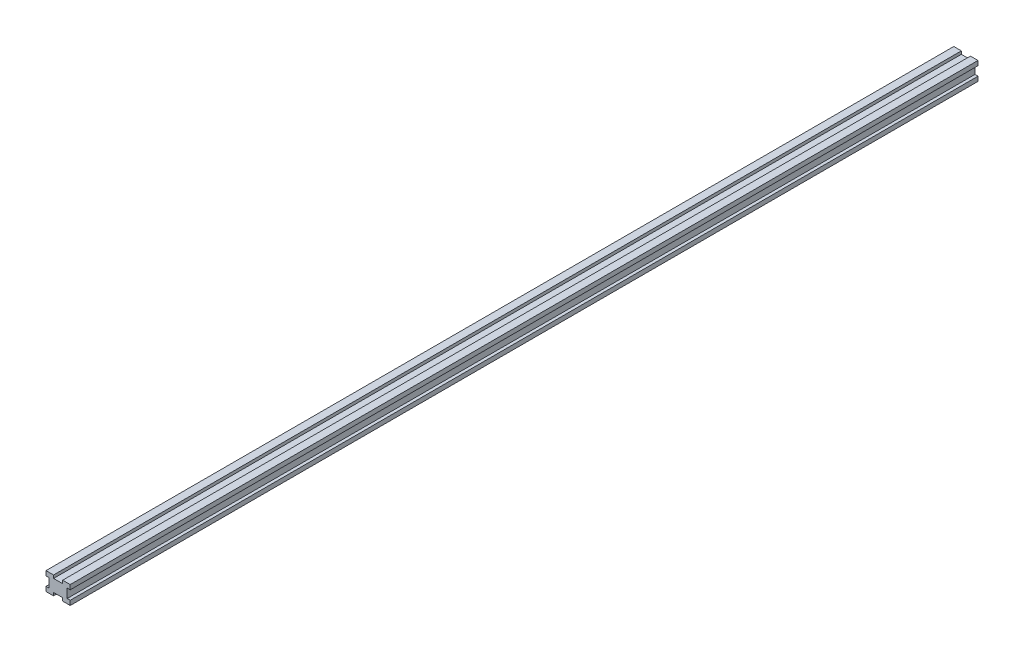
ISO-10303-21;
HEADER;
FILE_DESCRIPTION(('STEP AP214'),'2;1');
FILE_NAME('part.step','',(''),(''),'','','');
FILE_SCHEMA(('AUTOMOTIVE_DESIGN { 1 0 10303 214 1 1 1 1 }'));
ENDSEC;
DATA;
#1=APPLICATION_CONTEXT('core data for automotive mechanical design processes');
#2=APPLICATION_PROTOCOL_DEFINITION('international standard','automotive_design',2000,#1);
#3=PRODUCT_CONTEXT('',#1,'mechanical');
#4=PRODUCT('Part','Part','',(#3));
#5=PRODUCT_RELATED_PRODUCT_CATEGORY('part','',(#4));
#6=PRODUCT_DEFINITION_FORMATION('','',#4);
#7=PRODUCT_DEFINITION_CONTEXT('part definition',#1,'design');
#8=PRODUCT_DEFINITION('design','',#6,#7);
#9=PRODUCT_DEFINITION_SHAPE('','',#8);
#10=(LENGTH_UNIT() NAMED_UNIT(*) SI_UNIT(.MILLI.,.METRE.));
#11=(NAMED_UNIT(*) PLANE_ANGLE_UNIT() SI_UNIT($,.RADIAN.));
#12=(NAMED_UNIT(*) SI_UNIT($,.STERADIAN.) SOLID_ANGLE_UNIT());
#13=UNCERTAINTY_MEASURE_WITH_UNIT(LENGTH_MEASURE(1.E-05),#10,'distance_accuracy_value','');
#14=(GEOMETRIC_REPRESENTATION_CONTEXT(3) GLOBAL_UNCERTAINTY_ASSIGNED_CONTEXT((#13)) GLOBAL_UNIT_ASSIGNED_CONTEXT((#10,
#11,#12)) REPRESENTATION_CONTEXT('',''));
#15=CARTESIAN_POINT('',(0.,0.,0.));
#16=DIRECTION('',(0.,0.,1.));
#17=DIRECTION('',(1.,0.,0.));
#18=AXIS2_PLACEMENT_3D('',#15,#16,#17);
#19=CARTESIAN_POINT('',(20.,-15.,1500.));
#20=DIRECTION('',(-1.,0.,0.));
#21=DIRECTION('',(0.,0.,1.));
#22=AXIS2_PLACEMENT_3D('',#19,#20,#21);
#23=PLANE('',#22);
#24=DIRECTION('',(0.,1.,0.));
#25=VECTOR('',#24,1.);
#26=CARTESIAN_POINT('',(20.,-15.,0.));
#27=LINE('',#26,#25);
#28=CARTESIAN_POINT('',(20.,-15.,0.));
#29=VERTEX_POINT('',#28);
#30=CARTESIAN_POINT('',(20.,-7.5,0.));
#31=VERTEX_POINT('',#30);
#32=EDGE_CURVE('E193',#29,#31,#27,.T.);
#33=ORIENTED_EDGE('',*,*,#32,.T.);
#34=DIRECTION('',(0.,0.,1.));
#35=VECTOR('',#34,1.);
#36=CARTESIAN_POINT('',(20.,-7.5,0.));
#37=LINE('',#36,#35);
#38=CARTESIAN_POINT('',(20.,-7.5,1500.));
#39=VERTEX_POINT('',#38);
#40=EDGE_CURVE('E274',#31,#39,#37,.T.);
#41=ORIENTED_EDGE('',*,*,#40,.T.);
#42=DIRECTION('',(0.,1.,0.));
#43=VECTOR('',#42,1.);
#44=CARTESIAN_POINT('',(20.,-15.,1500.));
#45=LINE('',#44,#43);
#46=CARTESIAN_POINT('',(20.,-15.,1500.));
#47=VERTEX_POINT('',#46);
#48=EDGE_CURVE('E282',#47,#39,#45,.T.);
#49=ORIENTED_EDGE('',*,*,#48,.F.);
#50=DIRECTION('',(0.,0.,-1.));
#51=VECTOR('',#50,1.);
#52=CARTESIAN_POINT('',(20.,-15.,1500.));
#53=LINE('',#52,#51);
#54=EDGE_CURVE('E214',#47,#29,#53,.T.);
#55=ORIENTED_EDGE('',*,*,#54,.T.);
#56=EDGE_LOOP('',(#33,#41,#49,#55));
#57=FACE_BOUND('',#56,.T.);
#58=ADVANCED_FACE('F33',(#57),#23,.F.);
#59=CARTESIAN_POINT('',(-20.,-15.,1500.));
#60=DIRECTION('',(1.,0.,0.));
#61=DIRECTION('',(0.,0.,-1.));
#62=AXIS2_PLACEMENT_3D('',#59,#60,#61);
#63=PLANE('',#62);
#64=DIRECTION('',(0.,-1.,0.));
#65=VECTOR('',#64,1.);
#66=CARTESIAN_POINT('',(-20.,-15.,0.));
#67=LINE('',#66,#65);
#68=CARTESIAN_POINT('',(-20.,15.,0.));
#69=VERTEX_POINT('',#68);
#70=CARTESIAN_POINT('',(-20.,7.5,0.));
#71=VERTEX_POINT('',#70);
#72=EDGE_CURVE('E207',#69,#71,#67,.T.);
#73=ORIENTED_EDGE('',*,*,#72,.T.);
#74=DIRECTION('',(0.,0.,1.));
#75=VECTOR('',#74,1.);
#76=CARTESIAN_POINT('',(-20.,7.5,0.));
#77=LINE('',#76,#75);
#78=CARTESIAN_POINT('',(-20.,7.5,1500.));
#79=VERTEX_POINT('',#78);
#80=EDGE_CURVE('E255',#71,#79,#77,.T.);
#81=ORIENTED_EDGE('',*,*,#80,.T.);
#82=DIRECTION('',(0.,-1.,0.));
#83=VECTOR('',#82,1.);
#84=CARTESIAN_POINT('',(-20.,-15.,1500.));
#85=LINE('',#84,#83);
#86=CARTESIAN_POINT('',(-20.,15.,1500.));
#87=VERTEX_POINT('',#86);
#88=EDGE_CURVE('E227',#87,#79,#85,.T.);
#89=ORIENTED_EDGE('',*,*,#88,.F.);
#90=DIRECTION('',(0.,0.,-1.));
#91=VECTOR('',#90,1.);
#92=CARTESIAN_POINT('',(-20.,15.,1500.));
#93=LINE('',#92,#91);
#94=EDGE_CURVE('E41',#87,#69,#93,.T.);
#95=ORIENTED_EDGE('',*,*,#94,.T.);
#96=EDGE_LOOP('',(#73,#81,#89,#95));
#97=FACE_BOUND('',#96,.T.);
#98=ADVANCED_FACE('F224',(#97),#63,.F.);
#99=CARTESIAN_POINT('',(-20.,-15.,1500.));
#100=DIRECTION('',(0.,1.,0.));
#101=DIRECTION('',(0.,0.,1.));
#102=AXIS2_PLACEMENT_3D('',#99,#100,#101);
#103=PLANE('',#102);
#104=DIRECTION('',(1.,0.,0.));
#105=VECTOR('',#104,1.);
#106=CARTESIAN_POINT('',(-20.,-15.,0.));
#107=LINE('',#106,#105);
#108=CARTESIAN_POINT('',(-20.,-15.,0.));
#109=VERTEX_POINT('',#108);
#110=CARTESIAN_POINT('',(-7.5,-15.,0.));
#111=VERTEX_POINT('',#110);
#112=EDGE_CURVE('E211',#109,#111,#107,.T.);
#113=ORIENTED_EDGE('',*,*,#112,.T.);
#114=DIRECTION('',(0.,0.,1.));
#115=VECTOR('',#114,1.);
#116=CARTESIAN_POINT('',(-7.5,-15.,0.));
#117=LINE('',#116,#115);
#118=CARTESIAN_POINT('',(-7.5,-15.,1500.));
#119=VERTEX_POINT('',#118);
#120=EDGE_CURVE('E308',#111,#119,#117,.T.);
#121=ORIENTED_EDGE('',*,*,#120,.T.);
#122=DIRECTION('',(1.,0.,0.));
#123=VECTOR('',#122,1.);
#124=CARTESIAN_POINT('',(-20.,-15.,1500.));
#125=LINE('',#124,#123);
#126=CARTESIAN_POINT('',(-20.,-15.,1500.));
#127=VERTEX_POINT('',#126);
#128=EDGE_CURVE('E203',#127,#119,#125,.T.);
#129=ORIENTED_EDGE('',*,*,#128,.F.);
#130=DIRECTION('',(0.,0.,-1.));
#131=VECTOR('',#130,1.);
#132=CARTESIAN_POINT('',(-20.,-15.,1500.));
#133=LINE('',#132,#131);
#134=EDGE_CURVE('E217',#127,#109,#133,.T.);
#135=ORIENTED_EDGE('',*,*,#134,.T.);
#136=EDGE_LOOP('',(#113,#121,#129,#135));
#137=FACE_BOUND('',#136,.T.);
#138=ADVANCED_FACE('F307',(#137),#103,.F.);
#139=CARTESIAN_POINT('',(-20.,15.,1500.));
#140=DIRECTION('',(0.,-1.,0.));
#141=DIRECTION('',(0.,0.,-1.));
#142=AXIS2_PLACEMENT_3D('',#139,#140,#141);
#143=PLANE('',#142);
#144=DIRECTION('',(-1.,0.,0.));
#145=VECTOR('',#144,1.);
#146=CARTESIAN_POINT('',(-20.,15.,0.));
#147=LINE('',#146,#145);
#148=CARTESIAN_POINT('',(20.,15.,0.));
#149=VERTEX_POINT('',#148);
#150=CARTESIAN_POINT('',(7.5,15.,0.));
#151=VERTEX_POINT('',#150);
#152=EDGE_CURVE('E192',#149,#151,#147,.T.);
#153=ORIENTED_EDGE('',*,*,#152,.T.);
#154=DIRECTION('',(0.,0.,1.));
#155=VECTOR('',#154,1.);
#156=CARTESIAN_POINT('',(7.5,15.,0.));
#157=LINE('',#156,#155);
#158=CARTESIAN_POINT('',(7.5,15.,1500.));
#159=VERTEX_POINT('',#158);
#160=EDGE_CURVE('E194',#151,#159,#157,.T.);
#161=ORIENTED_EDGE('',*,*,#160,.T.);
#162=DIRECTION('',(-1.,0.,0.));
#163=VECTOR('',#162,1.);
#164=CARTESIAN_POINT('',(-20.,15.,1500.));
#165=LINE('',#164,#163);
#166=CARTESIAN_POINT('',(20.,15.,1500.));
#167=VERTEX_POINT('',#166);
#168=EDGE_CURVE('E286',#167,#159,#165,.T.);
#169=ORIENTED_EDGE('',*,*,#168,.F.);
#170=DIRECTION('',(0.,0.,-1.));
#171=VECTOR('',#170,1.);
#172=CARTESIAN_POINT('',(20.,15.,1500.));
#173=LINE('',#172,#171);
#174=EDGE_CURVE('E11',#167,#149,#173,.T.);
#175=ORIENTED_EDGE('',*,*,#174,.T.);
#176=EDGE_LOOP('',(#153,#161,#169,#175));
#177=FACE_BOUND('',#176,.T.);
#178=ADVANCED_FACE('F352',(#177),#143,.F.);
#179=CARTESIAN_POINT('',(20.,7.5,1500.));
#180=VERTEX_POINT('',#179);
#181=EDGE_CURVE('E185',#180,#167,#45,.T.);
#182=ORIENTED_EDGE('',*,*,#181,.F.);
#183=DIRECTION('',(0.,0.,1.));
#184=VECTOR('',#183,1.);
#185=CARTESIAN_POINT('',(20.,7.5,0.));
#186=LINE('',#185,#184);
#187=CARTESIAN_POINT('',(20.,7.5,0.));
#188=VERTEX_POINT('',#187);
#189=EDGE_CURVE('E173',#188,#180,#186,.T.);
#190=ORIENTED_EDGE('',*,*,#189,.F.);
#191=EDGE_CURVE('E183',#188,#149,#27,.T.);
#192=ORIENTED_EDGE('',*,*,#191,.T.);
#193=ORIENTED_EDGE('',*,*,#174,.F.);
#194=EDGE_LOOP('',(#182,#190,#192,#193));
#195=FACE_BOUND('',#194,.T.);
#196=ADVANCED_FACE('F35',(#195),#23,.F.);
#197=CARTESIAN_POINT('',(-7.5,15.,1500.));
#198=VERTEX_POINT('',#197);
#199=EDGE_CURVE('E285',#198,#87,#165,.T.);
#200=ORIENTED_EDGE('',*,*,#199,.F.);
#201=DIRECTION('',(0.,0.,1.));
#202=VECTOR('',#201,1.);
#203=CARTESIAN_POINT('',(-7.5,15.,0.));
#204=LINE('',#203,#202);
#205=CARTESIAN_POINT('',(-7.5,15.,0.));
#206=VERTEX_POINT('',#205);
#207=EDGE_CURVE('E269',#206,#198,#204,.T.);
#208=ORIENTED_EDGE('',*,*,#207,.F.);
#209=EDGE_CURVE('E197',#206,#69,#147,.T.);
#210=ORIENTED_EDGE('',*,*,#209,.T.);
#211=ORIENTED_EDGE('',*,*,#94,.F.);
#212=EDGE_LOOP('',(#200,#208,#210,#211));
#213=FACE_BOUND('',#212,.T.);
#214=ADVANCED_FACE('F351',(#213),#143,.F.);
#215=CARTESIAN_POINT('',(-20.,-7.5,1500.));
#216=VERTEX_POINT('',#215);
#217=EDGE_CURVE('E288',#216,#127,#85,.T.);
#218=ORIENTED_EDGE('',*,*,#217,.F.);
#219=DIRECTION('',(0.,0.,1.));
#220=VECTOR('',#219,1.);
#221=CARTESIAN_POINT('',(-20.,-7.5,0.));
#222=LINE('',#221,#220);
#223=CARTESIAN_POINT('',(-20.,-7.5,0.));
#224=VERTEX_POINT('',#223);
#225=EDGE_CURVE('E239',#224,#216,#222,.T.);
#226=ORIENTED_EDGE('',*,*,#225,.F.);
#227=EDGE_CURVE('E206',#224,#109,#67,.T.);
#228=ORIENTED_EDGE('',*,*,#227,.T.);
#229=ORIENTED_EDGE('',*,*,#134,.F.);
#230=EDGE_LOOP('',(#218,#226,#228,#229));
#231=FACE_BOUND('',#230,.T.);
#232=ADVANCED_FACE('F302',(#231),#63,.F.);
#233=CARTESIAN_POINT('',(7.5,-15.,1500.));
#234=VERTEX_POINT('',#233);
#235=EDGE_CURVE('E289',#234,#47,#125,.T.);
#236=ORIENTED_EDGE('',*,*,#235,.F.);
#237=DIRECTION('',(0.,0.,1.));
#238=VECTOR('',#237,1.);
#239=CARTESIAN_POINT('',(7.5,-15.,0.));
#240=LINE('',#239,#238);
#241=CARTESIAN_POINT('',(7.5,-15.,0.));
#242=VERTEX_POINT('',#241);
#243=EDGE_CURVE('E324',#242,#234,#240,.T.);
#244=ORIENTED_EDGE('',*,*,#243,.F.);
#245=EDGE_CURVE('E210',#242,#29,#107,.T.);
#246=ORIENTED_EDGE('',*,*,#245,.T.);
#247=ORIENTED_EDGE('',*,*,#54,.F.);
#248=EDGE_LOOP('',(#236,#244,#246,#247));
#249=FACE_BOUND('',#248,.T.);
#250=ADVANCED_FACE('F362',(#249),#103,.F.);
#251=CARTESIAN_POINT('',(0.,0.,1500.));
#252=DIRECTION('',(0.,0.,-1.));
#253=DIRECTION('',(-1.,0.,0.));
#254=AXIS2_PLACEMENT_3D('',#251,#252,#253);
#255=PLANE('',#254);
#256=ORIENTED_EDGE('',*,*,#48,.T.);
#257=DIRECTION('',(1.,0.,0.));
#258=VECTOR('',#257,1.);
#259=CARTESIAN_POINT('',(15.,-7.5,1500.));
#260=LINE('',#259,#258);
#261=CARTESIAN_POINT('',(15.,-7.5,1500.));
#262=VERTEX_POINT('',#261);
#263=EDGE_CURVE('E178',#262,#39,#260,.T.);
#264=ORIENTED_EDGE('',*,*,#263,.F.);
#265=DIRECTION('',(0.,-1.,0.));
#266=VECTOR('',#265,1.);
#267=CARTESIAN_POINT('',(15.,7.5,1500.));
#268=LINE('',#267,#266);
#269=CARTESIAN_POINT('',(15.,7.5,1500.));
#270=VERTEX_POINT('',#269);
#271=EDGE_CURVE('E315',#270,#262,#268,.T.);
#272=ORIENTED_EDGE('',*,*,#271,.F.);
#273=DIRECTION('',(-1.,0.,0.));
#274=VECTOR('',#273,1.);
#275=CARTESIAN_POINT('',(20.,7.5,1500.));
#276=LINE('',#275,#274);
#277=EDGE_CURVE('E312',#180,#270,#276,.T.);
#278=ORIENTED_EDGE('',*,*,#277,.F.);
#279=ORIENTED_EDGE('',*,*,#181,.T.);
#280=ORIENTED_EDGE('',*,*,#168,.T.);
#281=DIRECTION('',(0.,1.,0.));
#282=VECTOR('',#281,1.);
#283=CARTESIAN_POINT('',(7.5,10.,1500.));
#284=LINE('',#283,#282);
#285=CARTESIAN_POINT('',(7.5,10.,1500.));
#286=VERTEX_POINT('',#285);
#287=EDGE_CURVE('E264',#286,#159,#284,.T.);
#288=ORIENTED_EDGE('',*,*,#287,.F.);
#289=DIRECTION('',(1.,0.,0.));
#290=VECTOR('',#289,1.);
#291=CARTESIAN_POINT('',(-7.5,10.,1500.));
#292=LINE('',#291,#290);
#293=CARTESIAN_POINT('',(-7.5,10.,1500.));
#294=VERTEX_POINT('',#293);
#295=EDGE_CURVE('E273',#294,#286,#292,.T.);
#296=ORIENTED_EDGE('',*,*,#295,.F.);
#297=DIRECTION('',(0.,-1.,0.));
#298=VECTOR('',#297,1.);
#299=CARTESIAN_POINT('',(-7.5,15.,1500.));
#300=LINE('',#299,#298);
#301=EDGE_CURVE('E270',#198,#294,#300,.T.);
#302=ORIENTED_EDGE('',*,*,#301,.F.);
#303=ORIENTED_EDGE('',*,*,#199,.T.);
#304=ORIENTED_EDGE('',*,*,#88,.T.);
#305=DIRECTION('',(-1.,0.,0.));
#306=VECTOR('',#305,1.);
#307=CARTESIAN_POINT('',(-20.,7.5,1500.));
#308=LINE('',#307,#306);
#309=CARTESIAN_POINT('',(-15.,7.5,1500.));
#310=VERTEX_POINT('',#309);
#311=EDGE_CURVE('E253',#310,#79,#308,.T.);
#312=ORIENTED_EDGE('',*,*,#311,.F.);
#313=DIRECTION('',(0.,1.,0.));
#314=VECTOR('',#313,1.);
#315=CARTESIAN_POINT('',(-15.,7.5,1500.));
#316=LINE('',#315,#314);
#317=CARTESIAN_POINT('',(-15.,-7.5,1500.));
#318=VERTEX_POINT('',#317);
#319=EDGE_CURVE('E250',#318,#310,#316,.T.);
#320=ORIENTED_EDGE('',*,*,#319,.F.);
#321=DIRECTION('',(1.,0.,0.));
#322=VECTOR('',#321,1.);
#323=CARTESIAN_POINT('',(-15.,-7.5,1500.));
#324=LINE('',#323,#322);
#325=EDGE_CURVE('E247',#216,#318,#324,.T.);
#326=ORIENTED_EDGE('',*,*,#325,.F.);
#327=ORIENTED_EDGE('',*,*,#217,.T.);
#328=ORIENTED_EDGE('',*,*,#128,.T.);
#329=DIRECTION('',(0.,-1.,0.));
#330=VECTOR('',#329,1.);
#331=CARTESIAN_POINT('',(-7.5,-15.,1500.));
#332=LINE('',#331,#330);
#333=CARTESIAN_POINT('',(-7.5,-10.,1500.));
#334=VERTEX_POINT('',#333);
#335=EDGE_CURVE('E320',#334,#119,#332,.T.);
#336=ORIENTED_EDGE('',*,*,#335,.F.);
#337=DIRECTION('',(-1.,0.,0.));
#338=VECTOR('',#337,1.);
#339=CARTESIAN_POINT('',(-7.5,-10.,1500.));
#340=LINE('',#339,#338);
#341=CARTESIAN_POINT('',(7.5,-10.,1500.));
#342=VERTEX_POINT('',#341);
#343=EDGE_CURVE('E407',#342,#334,#340,.T.);
#344=ORIENTED_EDGE('',*,*,#343,.F.);
#345=DIRECTION('',(0.,1.,0.));
#346=VECTOR('',#345,1.);
#347=CARTESIAN_POINT('',(7.5,-10.,1500.));
#348=LINE('',#347,#346);
#349=EDGE_CURVE('E257',#234,#342,#348,.T.);
#350=ORIENTED_EDGE('',*,*,#349,.F.);
#351=ORIENTED_EDGE('',*,*,#235,.T.);
#352=EDGE_LOOP('',(#256,#264,#272,#278,#279,#280,#288,#296,#302,#303,#304,#312,#320,#326,#327,
#328,#336,#344,#350,#351));
#353=FACE_BOUND('',#352,.T.);
#354=ADVANCED_FACE('F296',(#353),#255,.F.);
#355=CARTESIAN_POINT('',(0.,0.,0.));
#356=DIRECTION('',(0.,0.,-1.));
#357=DIRECTION('',(-1.,0.,0.));
#358=AXIS2_PLACEMENT_3D('',#355,#356,#357);
#359=PLANE('',#358);
#360=DIRECTION('',(1.,0.,0.));
#361=VECTOR('',#360,1.);
#362=CARTESIAN_POINT('',(15.,-7.5,0.));
#363=LINE('',#362,#361);
#364=CARTESIAN_POINT('',(15.,-7.5,0.));
#365=VERTEX_POINT('',#364);
#366=EDGE_CURVE('E186',#365,#31,#363,.T.);
#367=ORIENTED_EDGE('',*,*,#366,.T.);
#368=ORIENTED_EDGE('',*,*,#32,.F.);
#369=ORIENTED_EDGE('',*,*,#245,.F.);
#370=DIRECTION('',(0.,1.,0.));
#371=VECTOR('',#370,1.);
#372=CARTESIAN_POINT('',(7.5,-10.,0.));
#373=LINE('',#372,#371);
#374=CARTESIAN_POINT('',(7.5,-10.,0.));
#375=VERTEX_POINT('',#374);
#376=EDGE_CURVE('E410',#242,#375,#373,.T.);
#377=ORIENTED_EDGE('',*,*,#376,.T.);
#378=DIRECTION('',(-1.,0.,0.));
#379=VECTOR('',#378,1.);
#380=CARTESIAN_POINT('',(-7.5,-10.,0.));
#381=LINE('',#380,#379);
#382=CARTESIAN_POINT('',(-7.5,-10.,0.));
#383=VERTEX_POINT('',#382);
#384=EDGE_CURVE('E56',#375,#383,#381,.T.);
#385=ORIENTED_EDGE('',*,*,#384,.T.);
#386=DIRECTION('',(0.,-1.,0.));
#387=VECTOR('',#386,1.);
#388=CARTESIAN_POINT('',(-7.5,-15.,0.));
#389=LINE('',#388,#387);
#390=EDGE_CURVE('E325',#383,#111,#389,.T.);
#391=ORIENTED_EDGE('',*,*,#390,.T.);
#392=ORIENTED_EDGE('',*,*,#112,.F.);
#393=ORIENTED_EDGE('',*,*,#227,.F.);
#394=DIRECTION('',(1.,0.,0.));
#395=VECTOR('',#394,1.);
#396=CARTESIAN_POINT('',(-15.,-7.5,0.));
#397=LINE('',#396,#395);
#398=CARTESIAN_POINT('',(-15.,-7.5,0.));
#399=VERTEX_POINT('',#398);
#400=EDGE_CURVE('E243',#224,#399,#397,.T.);
#401=ORIENTED_EDGE('',*,*,#400,.T.);
#402=DIRECTION('',(0.,1.,0.));
#403=VECTOR('',#402,1.);
#404=CARTESIAN_POINT('',(-15.,7.5,0.));
#405=LINE('',#404,#403);
#406=CARTESIAN_POINT('',(-15.,7.5,0.));
#407=VERTEX_POINT('',#406);
#408=EDGE_CURVE('E237',#399,#407,#405,.T.);
#409=ORIENTED_EDGE('',*,*,#408,.T.);
#410=DIRECTION('',(-1.,0.,0.));
#411=VECTOR('',#410,1.);
#412=CARTESIAN_POINT('',(-20.,7.5,0.));
#413=LINE('',#412,#411);
#414=EDGE_CURVE('E235',#407,#71,#413,.T.);
#415=ORIENTED_EDGE('',*,*,#414,.T.);
#416=ORIENTED_EDGE('',*,*,#72,.F.);
#417=ORIENTED_EDGE('',*,*,#209,.F.);
#418=DIRECTION('',(0.,-1.,0.));
#419=VECTOR('',#418,1.);
#420=CARTESIAN_POINT('',(-7.5,15.,0.));
#421=LINE('',#420,#419);
#422=CARTESIAN_POINT('',(-7.5,10.,0.));
#423=VERTEX_POINT('',#422);
#424=EDGE_CURVE('E261',#206,#423,#421,.T.);
#425=ORIENTED_EDGE('',*,*,#424,.T.);
#426=DIRECTION('',(1.,0.,0.));
#427=VECTOR('',#426,1.);
#428=CARTESIAN_POINT('',(-7.5,10.,0.));
#429=LINE('',#428,#427);
#430=CARTESIAN_POINT('',(7.5,10.,0.));
#431=VERTEX_POINT('',#430);
#432=EDGE_CURVE('E263',#423,#431,#429,.T.);
#433=ORIENTED_EDGE('',*,*,#432,.T.);
#434=DIRECTION('',(0.,1.,0.));
#435=VECTOR('',#434,1.);
#436=CARTESIAN_POINT('',(7.5,10.,0.));
#437=LINE('',#436,#435);
#438=EDGE_CURVE('E267',#431,#151,#437,.T.);
#439=ORIENTED_EDGE('',*,*,#438,.T.);
#440=ORIENTED_EDGE('',*,*,#152,.F.);
#441=ORIENTED_EDGE('',*,*,#191,.F.);
#442=DIRECTION('',(-1.,0.,0.));
#443=VECTOR('',#442,1.);
#444=CARTESIAN_POINT('',(20.,7.5,0.));
#445=LINE('',#444,#443);
#446=CARTESIAN_POINT('',(15.,7.5,0.));
#447=VERTEX_POINT('',#446);
#448=EDGE_CURVE('E169',#188,#447,#445,.T.);
#449=ORIENTED_EDGE('',*,*,#448,.T.);
#450=DIRECTION('',(0.,-1.,0.));
#451=VECTOR('',#450,1.);
#452=CARTESIAN_POINT('',(15.,7.5,0.));
#453=LINE('',#452,#451);
#454=EDGE_CURVE('E48',#447,#365,#453,.T.);
#455=ORIENTED_EDGE('',*,*,#454,.T.);
#456=EDGE_LOOP('',(#367,#368,#369,#377,#385,#391,#392,#393,#401,#409,#415,#416,#417,#425,#433,
#439,#440,#441,#449,#455));
#457=FACE_BOUND('',#456,.T.);
#458=ADVANCED_FACE('F189',(#457),#359,.T.);
#459=CARTESIAN_POINT('',(7.5,10.,0.));
#460=DIRECTION('',(1.,0.,0.));
#461=DIRECTION('',(0.,0.,-1.));
#462=AXIS2_PLACEMENT_3D('',#459,#460,#461);
#463=PLANE('',#462);
#464=ORIENTED_EDGE('',*,*,#287,.T.);
#465=ORIENTED_EDGE('',*,*,#160,.F.);
#466=ORIENTED_EDGE('',*,*,#438,.F.);
#467=DIRECTION('',(0.,0.,1.));
#468=VECTOR('',#467,1.);
#469=CARTESIAN_POINT('',(7.5,10.,0.));
#470=LINE('',#469,#468);
#471=EDGE_CURVE('E199',#431,#286,#470,.T.);
#472=ORIENTED_EDGE('',*,*,#471,.T.);
#473=EDGE_LOOP('',(#464,#465,#466,#472));
#474=FACE_BOUND('',#473,.T.);
#475=ADVANCED_FACE('F369',(#474),#463,.F.);
#476=CARTESIAN_POINT('',(-7.5,10.,0.));
#477=DIRECTION('',(0.,-1.,0.));
#478=DIRECTION('',(0.,0.,-1.));
#479=AXIS2_PLACEMENT_3D('',#476,#477,#478);
#480=PLANE('',#479);
#481=ORIENTED_EDGE('',*,*,#295,.T.);
#482=ORIENTED_EDGE('',*,*,#471,.F.);
#483=ORIENTED_EDGE('',*,*,#432,.F.);
#484=DIRECTION('',(0.,0.,1.));
#485=VECTOR('',#484,1.);
#486=CARTESIAN_POINT('',(-7.5,10.,0.));
#487=LINE('',#486,#485);
#488=EDGE_CURVE('E279',#423,#294,#487,.T.);
#489=ORIENTED_EDGE('',*,*,#488,.T.);
#490=EDGE_LOOP('',(#481,#482,#483,#489));
#491=FACE_BOUND('',#490,.T.);
#492=ADVANCED_FACE('F340',(#491),#480,.F.);
#493=CARTESIAN_POINT('',(-7.5,15.,0.));
#494=DIRECTION('',(-1.,0.,0.));
#495=DIRECTION('',(0.,0.,1.));
#496=AXIS2_PLACEMENT_3D('',#493,#494,#495);
#497=PLANE('',#496);
#498=ORIENTED_EDGE('',*,*,#301,.T.);
#499=ORIENTED_EDGE('',*,*,#488,.F.);
#500=ORIENTED_EDGE('',*,*,#424,.F.);
#501=ORIENTED_EDGE('',*,*,#207,.T.);
#502=EDGE_LOOP('',(#498,#499,#500,#501));
#503=FACE_BOUND('',#502,.T.);
#504=ADVANCED_FACE('F333',(#503),#497,.F.);
#505=CARTESIAN_POINT('',(-20.,7.5,0.));
#506=DIRECTION('',(0.,1.,0.));
#507=DIRECTION('',(0.,0.,1.));
#508=AXIS2_PLACEMENT_3D('',#505,#506,#507);
#509=PLANE('',#508);
#510=ORIENTED_EDGE('',*,*,#311,.T.);
#511=ORIENTED_EDGE('',*,*,#80,.F.);
#512=ORIENTED_EDGE('',*,*,#414,.F.);
#513=DIRECTION('',(0.,0.,1.));
#514=VECTOR('',#513,1.);
#515=CARTESIAN_POINT('',(-15.,7.5,0.));
#516=LINE('',#515,#514);
#517=EDGE_CURVE('E258',#407,#310,#516,.T.);
#518=ORIENTED_EDGE('',*,*,#517,.T.);
#519=EDGE_LOOP('',(#510,#511,#512,#518));
#520=FACE_BOUND('',#519,.T.);
#521=ADVANCED_FACE('F331',(#520),#509,.F.);
#522=CARTESIAN_POINT('',(-15.,7.5,0.));
#523=DIRECTION('',(1.,0.,0.));
#524=DIRECTION('',(0.,1.,0.));
#525=AXIS2_PLACEMENT_3D('',#522,#523,#524);
#526=PLANE('',#525);
#527=ORIENTED_EDGE('',*,*,#319,.T.);
#528=ORIENTED_EDGE('',*,*,#517,.F.);
#529=ORIENTED_EDGE('',*,*,#408,.F.);
#530=DIRECTION('',(0.,0.,1.));
#531=VECTOR('',#530,1.);
#532=CARTESIAN_POINT('',(-15.,-7.5,0.));
#533=LINE('',#532,#531);
#534=EDGE_CURVE('E241',#399,#318,#533,.T.);
#535=ORIENTED_EDGE('',*,*,#534,.T.);
#536=EDGE_LOOP('',(#527,#528,#529,#535));
#537=FACE_BOUND('',#536,.T.);
#538=ADVANCED_FACE('F330',(#537),#526,.F.);
#539=CARTESIAN_POINT('',(-15.,-7.5,0.));
#540=DIRECTION('',(0.,-1.,0.));
#541=DIRECTION('',(0.,0.,-1.));
#542=AXIS2_PLACEMENT_3D('',#539,#540,#541);
#543=PLANE('',#542);
#544=ORIENTED_EDGE('',*,*,#325,.T.);
#545=ORIENTED_EDGE('',*,*,#534,.F.);
#546=ORIENTED_EDGE('',*,*,#400,.F.);
#547=ORIENTED_EDGE('',*,*,#225,.T.);
#548=EDGE_LOOP('',(#544,#545,#546,#547));
#549=FACE_BOUND('',#548,.T.);
#550=ADVANCED_FACE('F328',(#549),#543,.F.);
#551=CARTESIAN_POINT('',(-7.5,-15.,0.));
#552=DIRECTION('',(-1.,0.,0.));
#553=DIRECTION('',(0.,0.,1.));
#554=AXIS2_PLACEMENT_3D('',#551,#552,#553);
#555=PLANE('',#554);
#556=ORIENTED_EDGE('',*,*,#335,.T.);
#557=ORIENTED_EDGE('',*,*,#120,.F.);
#558=ORIENTED_EDGE('',*,*,#390,.F.);
#559=DIRECTION('',(0.,0.,1.));
#560=VECTOR('',#559,1.);
#561=CARTESIAN_POINT('',(-7.5,-10.,0.));
#562=LINE('',#561,#560);
#563=EDGE_CURVE('E313',#383,#334,#562,.T.);
#564=ORIENTED_EDGE('',*,*,#563,.T.);
#565=EDGE_LOOP('',(#556,#557,#558,#564));
#566=FACE_BOUND('',#565,.T.);
#567=ADVANCED_FACE('F379',(#566),#555,.F.);
#568=CARTESIAN_POINT('',(-7.5,-10.,0.));
#569=DIRECTION('',(0.,1.,0.));
#570=DIRECTION('',(0.,0.,1.));
#571=AXIS2_PLACEMENT_3D('',#568,#569,#570);
#572=PLANE('',#571);
#573=ORIENTED_EDGE('',*,*,#343,.T.);
#574=ORIENTED_EDGE('',*,*,#563,.F.);
#575=ORIENTED_EDGE('',*,*,#384,.F.);
#576=DIRECTION('',(0.,0.,1.));
#577=VECTOR('',#576,1.);
#578=CARTESIAN_POINT('',(7.5,-10.,0.));
#579=LINE('',#578,#577);
#580=EDGE_CURVE('E317',#375,#342,#579,.T.);
#581=ORIENTED_EDGE('',*,*,#580,.T.);
#582=EDGE_LOOP('',(#573,#574,#575,#581));
#583=FACE_BOUND('',#582,.T.);
#584=ADVANCED_FACE('F383',(#583),#572,.F.);
#585=CARTESIAN_POINT('',(7.5,-10.,0.));
#586=DIRECTION('',(1.,0.,0.));
#587=DIRECTION('',(0.,0.,-1.));
#588=AXIS2_PLACEMENT_3D('',#585,#586,#587);
#589=PLANE('',#588);
#590=ORIENTED_EDGE('',*,*,#349,.T.);
#591=ORIENTED_EDGE('',*,*,#580,.F.);
#592=ORIENTED_EDGE('',*,*,#376,.F.);
#593=ORIENTED_EDGE('',*,*,#243,.T.);
#594=EDGE_LOOP('',(#590,#591,#592,#593));
#595=FACE_BOUND('',#594,.T.);
#596=ADVANCED_FACE('F388',(#595),#589,.F.);
#597=CARTESIAN_POINT('',(15.,-7.5,0.));
#598=DIRECTION('',(0.,-1.,0.));
#599=DIRECTION('',(1.,0.,0.));
#600=AXIS2_PLACEMENT_3D('',#597,#598,#599);
#601=PLANE('',#600);
#602=ORIENTED_EDGE('',*,*,#263,.T.);
#603=ORIENTED_EDGE('',*,*,#40,.F.);
#604=ORIENTED_EDGE('',*,*,#366,.F.);
#605=DIRECTION('',(0.,0.,1.));
#606=VECTOR('',#605,1.);
#607=CARTESIAN_POINT('',(15.,-7.5,0.));
#608=LINE('',#607,#606);
#609=EDGE_CURVE('E416',#365,#262,#608,.T.);
#610=ORIENTED_EDGE('',*,*,#609,.T.);
#611=EDGE_LOOP('',(#602,#603,#604,#610));
#612=FACE_BOUND('',#611,.T.);
#613=ADVANCED_FACE('F393',(#612),#601,.F.);
#614=CARTESIAN_POINT('',(15.,7.5,0.));
#615=DIRECTION('',(-1.,0.,0.));
#616=DIRECTION('',(0.,-1.,0.));
#617=AXIS2_PLACEMENT_3D('',#614,#615,#616);
#618=PLANE('',#617);
#619=ORIENTED_EDGE('',*,*,#271,.T.);
#620=ORIENTED_EDGE('',*,*,#609,.F.);
#621=ORIENTED_EDGE('',*,*,#454,.F.);
#622=DIRECTION('',(0.,0.,1.));
#623=VECTOR('',#622,1.);
#624=CARTESIAN_POINT('',(15.,7.5,0.));
#625=LINE('',#624,#623);
#626=EDGE_CURVE('E175',#447,#270,#625,.T.);
#627=ORIENTED_EDGE('',*,*,#626,.T.);
#628=EDGE_LOOP('',(#619,#620,#621,#627));
#629=FACE_BOUND('',#628,.T.);
#630=ADVANCED_FACE('F398',(#629),#618,.F.);
#631=CARTESIAN_POINT('',(20.,7.5,0.));
#632=DIRECTION('',(0.,1.,0.));
#633=DIRECTION('',(-1.,0.,0.));
#634=AXIS2_PLACEMENT_3D('',#631,#632,#633);
#635=PLANE('',#634);
#636=ORIENTED_EDGE('',*,*,#277,.T.);
#637=ORIENTED_EDGE('',*,*,#626,.F.);
#638=ORIENTED_EDGE('',*,*,#448,.F.);
#639=ORIENTED_EDGE('',*,*,#189,.T.);
#640=EDGE_LOOP('',(#636,#637,#638,#639));
#641=FACE_BOUND('',#640,.T.);
#642=ADVANCED_FACE('F172',(#641),#635,.F.);
#643=CLOSED_SHELL('',(#58,#98,#138,#178,#196,#214,#232,#250,#354,#458,#475,#492,#504,#521,#538,
#550,#567,#584,#596,#613,#630,#642));
#644=MANIFOLD_SOLID_BREP('B2',#643);
#645=ADVANCED_BREP_SHAPE_REPRESENTATION('',(#18,#644),#14);
#646=SHAPE_DEFINITION_REPRESENTATION(#9,#645);
ENDSEC;
END-ISO-10303-21;
